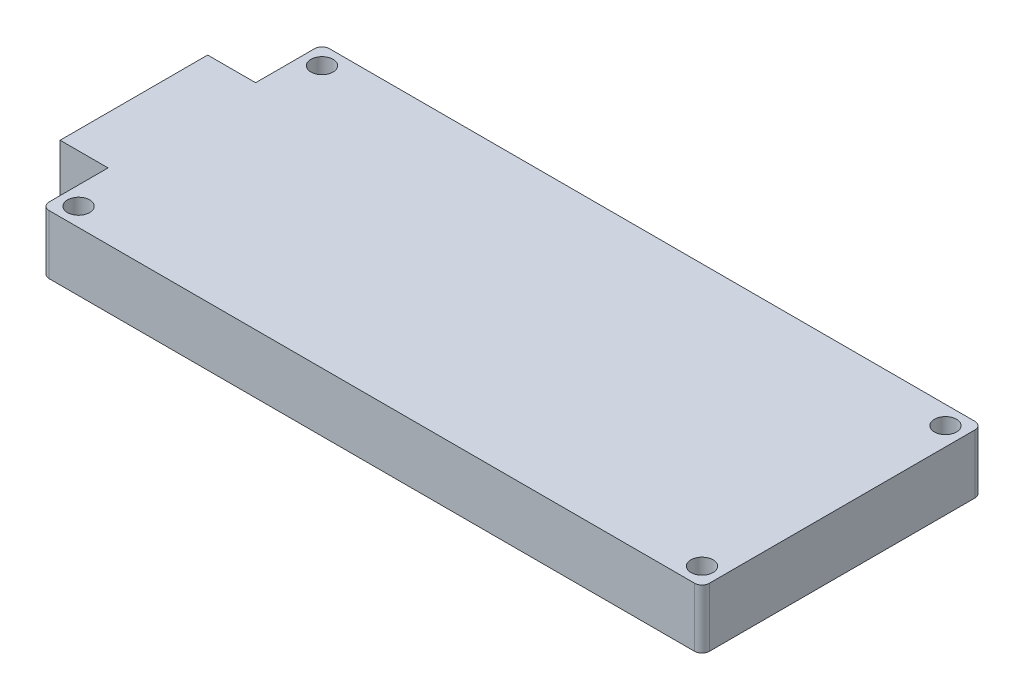
ISO-10303-21;
HEADER;
FILE_DESCRIPTION(('STEP AP214'),'2;1');
FILE_NAME('part.step','',(''),(''),'','','');
FILE_SCHEMA(('AUTOMOTIVE_DESIGN { 1 0 10303 214 1 1 1 1 }'));
ENDSEC;
DATA;
#1=APPLICATION_CONTEXT('core data for automotive mechanical design processes');
#2=APPLICATION_PROTOCOL_DEFINITION('international standard','automotive_design',2000,#1);
#3=PRODUCT_CONTEXT('',#1,'mechanical');
#4=PRODUCT('Part','Part','',(#3));
#5=PRODUCT_RELATED_PRODUCT_CATEGORY('part','',(#4));
#6=PRODUCT_DEFINITION_FORMATION('','',#4);
#7=PRODUCT_DEFINITION_CONTEXT('part definition',#1,'design');
#8=PRODUCT_DEFINITION('design','',#6,#7);
#9=PRODUCT_DEFINITION_SHAPE('','',#8);
#10=(LENGTH_UNIT() NAMED_UNIT(*) SI_UNIT(.MILLI.,.METRE.));
#11=(NAMED_UNIT(*) PLANE_ANGLE_UNIT() SI_UNIT($,.RADIAN.));
#12=(NAMED_UNIT(*) SI_UNIT($,.STERADIAN.) SOLID_ANGLE_UNIT());
#13=UNCERTAINTY_MEASURE_WITH_UNIT(LENGTH_MEASURE(1.E-05),#10,'distance_accuracy_value','');
#14=(GEOMETRIC_REPRESENTATION_CONTEXT(3) GLOBAL_UNCERTAINTY_ASSIGNED_CONTEXT((#13)) GLOBAL_UNIT_ASSIGNED_CONTEXT((#10,
#11,#12)) REPRESENTATION_CONTEXT('',''));
#15=CARTESIAN_POINT('',(0.,0.,0.));
#16=DIRECTION('',(0.,0.,1.));
#17=DIRECTION('',(1.,0.,0.));
#18=AXIS2_PLACEMENT_3D('',#15,#16,#17);
#19=CARTESIAN_POINT('',(-44.75,8.,-19.));
#20=DIRECTION('',(1.,0.,0.));
#21=DIRECTION('',(0.,0.,-1.));
#22=AXIS2_PLACEMENT_3D('',#19,#20,#21);
#23=PLANE('',#22);
#24=DIRECTION('',(0.,0.,1.));
#25=VECTOR('',#24,1.);
#26=CARTESIAN_POINT('',(-44.75,8.,-19.));
#27=LINE('',#26,#25);
#28=CARTESIAN_POINT('',(-44.75,8.,10.));
#29=VERTEX_POINT('',#28);
#30=CARTESIAN_POINT('',(-44.75,8.,18.));
#31=VERTEX_POINT('',#30);
#32=EDGE_CURVE('E47',#29,#31,#27,.T.);
#33=ORIENTED_EDGE('',*,*,#32,.F.);
#34=DIRECTION('',(0.,1.,0.));
#35=VECTOR('',#34,1.);
#36=CARTESIAN_POINT('',(-44.75,-21.0297408448131,10.));
#37=LINE('',#36,#35);
#38=CARTESIAN_POINT('',(-44.75,0.,10.));
#39=VERTEX_POINT('',#38);
#40=EDGE_CURVE('E153',#39,#29,#37,.T.);
#41=ORIENTED_EDGE('',*,*,#40,.F.);
#42=DIRECTION('',(0.,0.,1.));
#43=VECTOR('',#42,1.);
#44=CARTESIAN_POINT('',(-44.75,0.,-19.));
#45=LINE('',#44,#43);
#46=CARTESIAN_POINT('',(-44.75,0.,18.));
#47=VERTEX_POINT('',#46);
#48=EDGE_CURVE('E200',#39,#47,#45,.T.);
#49=ORIENTED_EDGE('',*,*,#48,.T.);
#50=DIRECTION('',(0.,-1.,0.));
#51=VECTOR('',#50,1.);
#52=CARTESIAN_POINT('',(-44.75,8.,18.));
#53=LINE('',#52,#51);
#54=EDGE_CURVE('E11',#47,#31,#53,.F.);
#55=ORIENTED_EDGE('',*,*,#54,.T.);
#56=EDGE_LOOP('',(#33,#41,#49,#55));
#57=FACE_BOUND('',#56,.T.);
#58=ADVANCED_FACE('F33',(#57),#23,.F.);
#59=CARTESIAN_POINT('',(44.75,8.,-19.));
#60=DIRECTION('',(-1.,0.,0.));
#61=DIRECTION('',(0.,0.,1.));
#62=AXIS2_PLACEMENT_3D('',#59,#60,#61);
#63=PLANE('',#62);
#64=DIRECTION('',(0.,0.,-1.));
#65=VECTOR('',#64,1.);
#66=CARTESIAN_POINT('',(44.75,0.,-19.));
#67=LINE('',#66,#65);
#68=CARTESIAN_POINT('',(44.75,0.,18.));
#69=VERTEX_POINT('',#68);
#70=CARTESIAN_POINT('',(44.75,0.,-18.));
#71=VERTEX_POINT('',#70);
#72=EDGE_CURVE('E181',#69,#71,#67,.T.);
#73=ORIENTED_EDGE('',*,*,#72,.T.);
#74=DIRECTION('',(0.,-1.,0.));
#75=VECTOR('',#74,1.);
#76=CARTESIAN_POINT('',(44.75,8.,-18.));
#77=LINE('',#76,#75);
#78=CARTESIAN_POINT('',(44.75,8.,-18.));
#79=VERTEX_POINT('',#78);
#80=EDGE_CURVE('E221',#71,#79,#77,.F.);
#81=ORIENTED_EDGE('',*,*,#80,.T.);
#82=DIRECTION('',(0.,0.,-1.));
#83=VECTOR('',#82,1.);
#84=CARTESIAN_POINT('',(44.75,8.,-19.));
#85=LINE('',#84,#83);
#86=CARTESIAN_POINT('',(44.75,8.,18.));
#87=VERTEX_POINT('',#86);
#88=EDGE_CURVE('E184',#87,#79,#85,.T.);
#89=ORIENTED_EDGE('',*,*,#88,.F.);
#90=DIRECTION('',(0.,-1.,0.));
#91=VECTOR('',#90,1.);
#92=CARTESIAN_POINT('',(44.75,8.,18.));
#93=LINE('',#92,#91);
#94=EDGE_CURVE('E218',#87,#69,#93,.T.);
#95=ORIENTED_EDGE('',*,*,#94,.T.);
#96=EDGE_LOOP('',(#73,#81,#89,#95));
#97=FACE_BOUND('',#96,.T.);
#98=ADVANCED_FACE('F264',(#97),#63,.F.);
#99=CARTESIAN_POINT('',(-44.75,8.,-19.));
#100=DIRECTION('',(0.,0.,1.));
#101=DIRECTION('',(1.,0.,0.));
#102=AXIS2_PLACEMENT_3D('',#99,#100,#101);
#103=PLANE('',#102);
#104=DIRECTION('',(-1.,0.,0.));
#105=VECTOR('',#104,1.);
#106=CARTESIAN_POINT('',(-44.75,8.,-19.));
#107=LINE('',#106,#105);
#108=CARTESIAN_POINT('',(43.75,8.,-19.));
#109=VERTEX_POINT('',#108);
#110=CARTESIAN_POINT('',(-43.75,8.,-19.));
#111=VERTEX_POINT('',#110);
#112=EDGE_CURVE('E186',#109,#111,#107,.T.);
#113=ORIENTED_EDGE('',*,*,#112,.F.);
#114=DIRECTION('',(0.,-1.,0.));
#115=VECTOR('',#114,1.);
#116=CARTESIAN_POINT('',(43.75,8.,-19.));
#117=LINE('',#116,#115);
#118=CARTESIAN_POINT('',(43.75,0.,-19.));
#119=VERTEX_POINT('',#118);
#120=EDGE_CURVE('E206',#109,#119,#117,.T.);
#121=ORIENTED_EDGE('',*,*,#120,.T.);
#122=DIRECTION('',(-1.,0.,0.));
#123=VECTOR('',#122,1.);
#124=CARTESIAN_POINT('',(-44.75,0.,-19.));
#125=LINE('',#124,#123);
#126=CARTESIAN_POINT('',(-43.75,0.,-19.));
#127=VERTEX_POINT('',#126);
#128=EDGE_CURVE('E197',#119,#127,#125,.T.);
#129=ORIENTED_EDGE('',*,*,#128,.T.);
#130=DIRECTION('',(0.,-1.,0.));
#131=VECTOR('',#130,1.);
#132=CARTESIAN_POINT('',(-43.75,8.,-19.));
#133=LINE('',#132,#131);
#134=EDGE_CURVE('E194',#127,#111,#133,.F.);
#135=ORIENTED_EDGE('',*,*,#134,.T.);
#136=EDGE_LOOP('',(#113,#121,#129,#135));
#137=FACE_BOUND('',#136,.T.);
#138=ADVANCED_FACE('F272',(#137),#103,.F.);
#139=CARTESIAN_POINT('',(-44.75,0.,-18.));
#140=VERTEX_POINT('',#139);
#141=CARTESIAN_POINT('',(-44.75,0.,-10.));
#142=VERTEX_POINT('',#141);
#143=EDGE_CURVE('E201',#140,#142,#45,.T.);
#144=ORIENTED_EDGE('',*,*,#143,.T.);
#145=DIRECTION('',(0.,1.,0.));
#146=VECTOR('',#145,1.);
#147=CARTESIAN_POINT('',(-44.75,-21.0297408448131,-10.));
#148=LINE('',#147,#146);
#149=CARTESIAN_POINT('',(-44.75,8.,-10.));
#150=VERTEX_POINT('',#149);
#151=EDGE_CURVE('E55',#142,#150,#148,.T.);
#152=ORIENTED_EDGE('',*,*,#151,.T.);
#153=CARTESIAN_POINT('',(-44.75,8.,-18.));
#154=VERTEX_POINT('',#153);
#155=EDGE_CURVE('E146',#154,#150,#27,.T.);
#156=ORIENTED_EDGE('',*,*,#155,.F.);
#157=DIRECTION('',(0.,-1.,0.));
#158=VECTOR('',#157,1.);
#159=CARTESIAN_POINT('',(-44.75,8.,-18.));
#160=LINE('',#159,#158);
#161=EDGE_CURVE('E41',#154,#140,#160,.T.);
#162=ORIENTED_EDGE('',*,*,#161,.T.);
#163=EDGE_LOOP('',(#144,#152,#156,#162));
#164=FACE_BOUND('',#163,.T.);
#165=ADVANCED_FACE('F238',(#164),#23,.F.);
#166=CARTESIAN_POINT('',(-44.75,8.,19.));
#167=DIRECTION('',(0.,0.,-1.));
#168=DIRECTION('',(-1.,0.,0.));
#169=AXIS2_PLACEMENT_3D('',#166,#167,#168);
#170=PLANE('',#169);
#171=DIRECTION('',(1.,0.,0.));
#172=VECTOR('',#171,1.);
#173=CARTESIAN_POINT('',(-44.75,0.,19.));
#174=LINE('',#173,#172);
#175=CARTESIAN_POINT('',(-43.75,0.,19.));
#176=VERTEX_POINT('',#175);
#177=CARTESIAN_POINT('',(43.75,0.,19.));
#178=VERTEX_POINT('',#177);
#179=EDGE_CURVE('E187',#176,#178,#174,.T.);
#180=ORIENTED_EDGE('',*,*,#179,.T.);
#181=DIRECTION('',(0.,-1.,0.));
#182=VECTOR('',#181,1.);
#183=CARTESIAN_POINT('',(43.75,8.,19.));
#184=LINE('',#183,#182);
#185=CARTESIAN_POINT('',(43.75,8.,19.));
#186=VERTEX_POINT('',#185);
#187=EDGE_CURVE('E234',#178,#186,#184,.F.);
#188=ORIENTED_EDGE('',*,*,#187,.T.);
#189=DIRECTION('',(1.,0.,0.));
#190=VECTOR('',#189,1.);
#191=CARTESIAN_POINT('',(-44.75,8.,19.));
#192=LINE('',#191,#190);
#193=CARTESIAN_POINT('',(-43.75,8.,19.));
#194=VERTEX_POINT('',#193);
#195=EDGE_CURVE('E191',#194,#186,#192,.T.);
#196=ORIENTED_EDGE('',*,*,#195,.F.);
#197=DIRECTION('',(0.,-1.,0.));
#198=VECTOR('',#197,1.);
#199=CARTESIAN_POINT('',(-43.75,8.,19.));
#200=LINE('',#199,#198);
#201=EDGE_CURVE('E231',#194,#176,#200,.T.);
#202=ORIENTED_EDGE('',*,*,#201,.T.);
#203=EDGE_LOOP('',(#180,#188,#196,#202));
#204=FACE_BOUND('',#203,.T.);
#205=ADVANCED_FACE('F255',(#204),#170,.F.);
#206=CARTESIAN_POINT('',(0.,8.,0.));
#207=DIRECTION('',(0.,1.,0.));
#208=DIRECTION('',(0.,0.,1.));
#209=AXIS2_PLACEMENT_3D('',#206,#207,#208);
#210=PLANE('',#209);
#211=CARTESIAN_POINT('',(-42.25,8.,16.5));
#212=DIRECTION('',(0.,1.,0.));
#213=DIRECTION('',(0.,0.,1.));
#214=AXIS2_PLACEMENT_3D('',#211,#212,#213);
#215=CIRCLE('',#214,1.5);
#216=CARTESIAN_POINT('',(-42.25,8.,18.));
#217=VERTEX_POINT('',#216);
#218=EDGE_CURVE('E159',#217,#217,#215,.T.);
#219=ORIENTED_EDGE('',*,*,#218,.F.);
#220=EDGE_LOOP('',(#219));
#221=FACE_BOUND('',#220,.T.);
#222=CARTESIAN_POINT('',(42.25,8.,16.5));
#223=DIRECTION('',(0.,1.,0.));
#224=DIRECTION('',(0.,0.,1.));
#225=AXIS2_PLACEMENT_3D('',#222,#223,#224);
#226=CIRCLE('',#225,1.5);
#227=CARTESIAN_POINT('',(42.25,8.,18.));
#228=VERTEX_POINT('',#227);
#229=EDGE_CURVE('E170',#228,#228,#226,.T.);
#230=ORIENTED_EDGE('',*,*,#229,.F.);
#231=EDGE_LOOP('',(#230));
#232=FACE_BOUND('',#231,.T.);
#233=CARTESIAN_POINT('',(42.25,8.,-16.5));
#234=DIRECTION('',(0.,1.,0.));
#235=DIRECTION('',(0.,0.,1.));
#236=AXIS2_PLACEMENT_3D('',#233,#234,#235);
#237=CIRCLE('',#236,1.5);
#238=CARTESIAN_POINT('',(42.25,8.,-15.));
#239=VERTEX_POINT('',#238);
#240=EDGE_CURVE('E164',#239,#239,#237,.T.);
#241=ORIENTED_EDGE('',*,*,#240,.F.);
#242=EDGE_LOOP('',(#241));
#243=FACE_BOUND('',#242,.T.);
#244=CARTESIAN_POINT('',(-42.25,8.,-16.5));
#245=DIRECTION('',(0.,1.,0.));
#246=DIRECTION('',(0.,0.,1.));
#247=AXIS2_PLACEMENT_3D('',#244,#245,#246);
#248=CIRCLE('',#247,1.5);
#249=CARTESIAN_POINT('',(-42.25,8.,-15.));
#250=VERTEX_POINT('',#249);
#251=EDGE_CURVE('E163',#250,#250,#248,.T.);
#252=ORIENTED_EDGE('',*,*,#251,.F.);
#253=EDGE_LOOP('',(#252));
#254=FACE_BOUND('',#253,.T.);
#255=ORIENTED_EDGE('',*,*,#88,.T.);
#256=CARTESIAN_POINT('',(43.75,8.,-18.));
#257=DIRECTION('',(0.,1.,0.));
#258=DIRECTION('',(0.,0.,1.));
#259=AXIS2_PLACEMENT_3D('',#256,#257,#258);
#260=CIRCLE('',#259,1.);
#261=EDGE_CURVE('E229',#79,#109,#260,.T.);
#262=ORIENTED_EDGE('',*,*,#261,.T.);
#263=ORIENTED_EDGE('',*,*,#112,.T.);
#264=CARTESIAN_POINT('',(-43.75,8.,-18.));
#265=DIRECTION('',(0.,1.,0.));
#266=DIRECTION('',(0.,0.,1.));
#267=AXIS2_PLACEMENT_3D('',#264,#265,#266);
#268=CIRCLE('',#267,1.);
#269=EDGE_CURVE('E223',#111,#154,#268,.T.);
#270=ORIENTED_EDGE('',*,*,#269,.T.);
#271=ORIENTED_EDGE('',*,*,#155,.T.);
#272=DIRECTION('',(-1.,0.,0.));
#273=VECTOR('',#272,1.);
#274=CARTESIAN_POINT('',(-44.75,8.,-10.));
#275=LINE('',#274,#273);
#276=CARTESIAN_POINT('',(-51.25,8.,-10.));
#277=VERTEX_POINT('',#276);
#278=EDGE_CURVE('E128',#150,#277,#275,.T.);
#279=ORIENTED_EDGE('',*,*,#278,.T.);
#280=DIRECTION('',(0.,0.,1.));
#281=VECTOR('',#280,1.);
#282=CARTESIAN_POINT('',(-51.25,8.,-10.));
#283=LINE('',#282,#281);
#284=CARTESIAN_POINT('',(-51.25,8.,10.));
#285=VERTEX_POINT('',#284);
#286=EDGE_CURVE('E136',#277,#285,#283,.T.);
#287=ORIENTED_EDGE('',*,*,#286,.T.);
#288=DIRECTION('',(1.,0.,0.));
#289=VECTOR('',#288,1.);
#290=CARTESIAN_POINT('',(-44.75,8.,10.));
#291=LINE('',#290,#289);
#292=EDGE_CURVE('E142',#285,#29,#291,.T.);
#293=ORIENTED_EDGE('',*,*,#292,.T.);
#294=ORIENTED_EDGE('',*,*,#32,.T.);
#295=CARTESIAN_POINT('',(-43.75,8.,18.));
#296=DIRECTION('',(0.,1.,0.));
#297=DIRECTION('',(0.,0.,1.));
#298=AXIS2_PLACEMENT_3D('',#295,#296,#297);
#299=CIRCLE('',#298,1.);
#300=EDGE_CURVE('E225',#31,#194,#299,.T.);
#301=ORIENTED_EDGE('',*,*,#300,.T.);
#302=ORIENTED_EDGE('',*,*,#195,.T.);
#303=CARTESIAN_POINT('',(43.75,8.,18.));
#304=DIRECTION('',(0.,1.,0.));
#305=DIRECTION('',(0.,0.,1.));
#306=AXIS2_PLACEMENT_3D('',#303,#304,#305);
#307=CIRCLE('',#306,1.);
#308=EDGE_CURVE('E227',#186,#87,#307,.T.);
#309=ORIENTED_EDGE('',*,*,#308,.T.);
#310=EDGE_LOOP('',(#255,#262,#263,#270,#271,#279,#287,#293,#294,#301,#302,#309));
#311=FACE_BOUND('',#310,.T.);
#312=ADVANCED_FACE('F145',(#221,#232,#243,#254,#311),#210,.T.);
#313=CARTESIAN_POINT('',(0.,0.,0.));
#314=DIRECTION('',(0.,1.,0.));
#315=DIRECTION('',(0.,0.,1.));
#316=AXIS2_PLACEMENT_3D('',#313,#314,#315);
#317=PLANE('',#316);
#318=CARTESIAN_POINT('',(-42.25,0.,16.5));
#319=DIRECTION('',(0.,1.,0.));
#320=DIRECTION('',(0.,0.,1.));
#321=AXIS2_PLACEMENT_3D('',#318,#319,#320);
#322=CIRCLE('',#321,1.5);
#323=CARTESIAN_POINT('',(-42.25,0.,18.));
#324=VERTEX_POINT('',#323);
#325=EDGE_CURVE('E173',#324,#324,#322,.T.);
#326=ORIENTED_EDGE('',*,*,#325,.T.);
#327=EDGE_LOOP('',(#326));
#328=FACE_BOUND('',#327,.T.);
#329=CARTESIAN_POINT('',(42.25,0.,16.5));
#330=DIRECTION('',(0.,1.,0.));
#331=DIRECTION('',(0.,0.,1.));
#332=AXIS2_PLACEMENT_3D('',#329,#330,#331);
#333=CIRCLE('',#332,1.5);
#334=CARTESIAN_POINT('',(42.25,0.,18.));
#335=VERTEX_POINT('',#334);
#336=EDGE_CURVE('E167',#335,#335,#333,.T.);
#337=ORIENTED_EDGE('',*,*,#336,.T.);
#338=EDGE_LOOP('',(#337));
#339=FACE_BOUND('',#338,.T.);
#340=CARTESIAN_POINT('',(42.25,0.,-16.5));
#341=DIRECTION('',(0.,1.,0.));
#342=DIRECTION('',(0.,0.,1.));
#343=AXIS2_PLACEMENT_3D('',#340,#341,#342);
#344=CIRCLE('',#343,1.5);
#345=CARTESIAN_POINT('',(42.25,0.,-15.));
#346=VERTEX_POINT('',#345);
#347=EDGE_CURVE('E160',#346,#346,#344,.T.);
#348=ORIENTED_EDGE('',*,*,#347,.T.);
#349=EDGE_LOOP('',(#348));
#350=FACE_BOUND('',#349,.T.);
#351=CARTESIAN_POINT('',(-42.25,0.,-16.5));
#352=DIRECTION('',(0.,1.,0.));
#353=DIRECTION('',(0.,0.,1.));
#354=AXIS2_PLACEMENT_3D('',#351,#352,#353);
#355=CIRCLE('',#354,1.5);
#356=CARTESIAN_POINT('',(-42.25,0.,-15.));
#357=VERTEX_POINT('',#356);
#358=EDGE_CURVE('E178',#357,#357,#355,.T.);
#359=ORIENTED_EDGE('',*,*,#358,.T.);
#360=EDGE_LOOP('',(#359));
#361=FACE_BOUND('',#360,.T.);
#362=ORIENTED_EDGE('',*,*,#128,.F.);
#363=CARTESIAN_POINT('',(43.75,0.,-18.));
#364=DIRECTION('',(0.,1.,0.));
#365=DIRECTION('',(0.,0.,1.));
#366=AXIS2_PLACEMENT_3D('',#363,#364,#365);
#367=CIRCLE('',#366,1.);
#368=EDGE_CURVE('E216',#119,#71,#367,.F.);
#369=ORIENTED_EDGE('',*,*,#368,.T.);
#370=ORIENTED_EDGE('',*,*,#72,.F.);
#371=CARTESIAN_POINT('',(43.75,0.,18.));
#372=DIRECTION('',(0.,1.,0.));
#373=DIRECTION('',(0.,0.,1.));
#374=AXIS2_PLACEMENT_3D('',#371,#372,#373);
#375=CIRCLE('',#374,1.);
#376=EDGE_CURVE('E214',#69,#178,#375,.F.);
#377=ORIENTED_EDGE('',*,*,#376,.T.);
#378=ORIENTED_EDGE('',*,*,#179,.F.);
#379=CARTESIAN_POINT('',(-43.75,0.,18.));
#380=DIRECTION('',(0.,1.,0.));
#381=DIRECTION('',(0.,0.,1.));
#382=AXIS2_PLACEMENT_3D('',#379,#380,#381);
#383=CIRCLE('',#382,1.);
#384=EDGE_CURVE('E211',#176,#47,#383,.F.);
#385=ORIENTED_EDGE('',*,*,#384,.T.);
#386=ORIENTED_EDGE('',*,*,#48,.F.);
#387=DIRECTION('',(-1.,0.,0.));
#388=VECTOR('',#387,1.);
#389=CARTESIAN_POINT('',(-44.75,0.,10.));
#390=LINE('',#389,#388);
#391=CARTESIAN_POINT('',(-51.25,0.,10.));
#392=VERTEX_POINT('',#391);
#393=EDGE_CURVE('E149',#39,#392,#390,.T.);
#394=ORIENTED_EDGE('',*,*,#393,.T.);
#395=DIRECTION('',(0.,0.,-1.));
#396=VECTOR('',#395,1.);
#397=CARTESIAN_POINT('',(-51.25,0.,-10.));
#398=LINE('',#397,#396);
#399=CARTESIAN_POINT('',(-51.25,0.,-10.));
#400=VERTEX_POINT('',#399);
#401=EDGE_CURVE('E155',#392,#400,#398,.T.);
#402=ORIENTED_EDGE('',*,*,#401,.T.);
#403=DIRECTION('',(1.,0.,0.));
#404=VECTOR('',#403,1.);
#405=CARTESIAN_POINT('',(-44.75,0.,-10.));
#406=LINE('',#405,#404);
#407=EDGE_CURVE('E130',#400,#142,#406,.T.);
#408=ORIENTED_EDGE('',*,*,#407,.T.);
#409=ORIENTED_EDGE('',*,*,#143,.F.);
#410=CARTESIAN_POINT('',(-43.75,0.,-18.));
#411=DIRECTION('',(0.,1.,0.));
#412=DIRECTION('',(0.,0.,1.));
#413=AXIS2_PLACEMENT_3D('',#410,#411,#412);
#414=CIRCLE('',#413,1.);
#415=EDGE_CURVE('E209',#140,#127,#414,.F.);
#416=ORIENTED_EDGE('',*,*,#415,.T.);
#417=EDGE_LOOP('',(#362,#369,#370,#377,#378,#385,#386,#394,#402,#408,#409,#416));
#418=FACE_BOUND('',#417,.T.);
#419=ADVANCED_FACE('F243',(#328,#339,#350,#361,#418),#317,.F.);
#420=CARTESIAN_POINT('',(-42.25,0.,-16.5));
#421=DIRECTION('',(0.,1.,0.));
#422=DIRECTION('',(0.,0.,1.));
#423=AXIS2_PLACEMENT_3D('',#420,#421,#422);
#424=CYLINDRICAL_SURFACE('',#423,1.5);
#425=ORIENTED_EDGE('',*,*,#358,.F.);
#426=EDGE_LOOP('',(#425));
#427=FACE_BOUND('',#426,.T.);
#428=ORIENTED_EDGE('',*,*,#251,.T.);
#429=EDGE_LOOP('',(#428));
#430=FACE_BOUND('',#429,.T.);
#431=ADVANCED_FACE('F342',(#427,#430),#424,.F.);
#432=CARTESIAN_POINT('',(42.25,0.,-16.5));
#433=DIRECTION('',(0.,1.,0.));
#434=DIRECTION('',(0.,0.,1.));
#435=AXIS2_PLACEMENT_3D('',#432,#433,#434);
#436=CYLINDRICAL_SURFACE('',#435,1.5);
#437=ORIENTED_EDGE('',*,*,#347,.F.);
#438=EDGE_LOOP('',(#437));
#439=FACE_BOUND('',#438,.T.);
#440=ORIENTED_EDGE('',*,*,#240,.T.);
#441=EDGE_LOOP('',(#440));
#442=FACE_BOUND('',#441,.T.);
#443=ADVANCED_FACE('F372',(#439,#442),#436,.F.);
#444=CARTESIAN_POINT('',(42.25,0.,16.5));
#445=DIRECTION('',(0.,1.,0.));
#446=DIRECTION('',(0.,0.,1.));
#447=AXIS2_PLACEMENT_3D('',#444,#445,#446);
#448=CYLINDRICAL_SURFACE('',#447,1.5);
#449=ORIENTED_EDGE('',*,*,#336,.F.);
#450=EDGE_LOOP('',(#449));
#451=FACE_BOUND('',#450,.T.);
#452=ORIENTED_EDGE('',*,*,#229,.T.);
#453=EDGE_LOOP('',(#452));
#454=FACE_BOUND('',#453,.T.);
#455=ADVANCED_FACE('F375',(#451,#454),#448,.F.);
#456=CARTESIAN_POINT('',(-42.25,0.,16.5));
#457=DIRECTION('',(0.,1.,0.));
#458=DIRECTION('',(0.,0.,1.));
#459=AXIS2_PLACEMENT_3D('',#456,#457,#458);
#460=CYLINDRICAL_SURFACE('',#459,1.5);
#461=ORIENTED_EDGE('',*,*,#325,.F.);
#462=EDGE_LOOP('',(#461));
#463=FACE_BOUND('',#462,.T.);
#464=ORIENTED_EDGE('',*,*,#218,.T.);
#465=EDGE_LOOP('',(#464));
#466=FACE_BOUND('',#465,.T.);
#467=ADVANCED_FACE('F298',(#463,#466),#460,.F.);
#468=CARTESIAN_POINT('',(43.75,8.,-18.));
#469=DIRECTION('',(0.,-1.,0.));
#470=DIRECTION('',(0.,0.,-1.));
#471=AXIS2_PLACEMENT_3D('',#468,#469,#470);
#472=CYLINDRICAL_SURFACE('',#471,1.);
#473=ORIENTED_EDGE('',*,*,#261,.F.);
#474=ORIENTED_EDGE('',*,*,#80,.F.);
#475=ORIENTED_EDGE('',*,*,#368,.F.);
#476=ORIENTED_EDGE('',*,*,#120,.F.);
#477=EDGE_LOOP('',(#473,#474,#475,#476));
#478=FACE_BOUND('',#477,.T.);
#479=ADVANCED_FACE('F270',(#478),#472,.T.);
#480=CARTESIAN_POINT('',(43.75,8.,18.));
#481=DIRECTION('',(0.,-1.,0.));
#482=DIRECTION('',(0.,0.,-1.));
#483=AXIS2_PLACEMENT_3D('',#480,#481,#482);
#484=CYLINDRICAL_SURFACE('',#483,1.);
#485=ORIENTED_EDGE('',*,*,#308,.F.);
#486=ORIENTED_EDGE('',*,*,#187,.F.);
#487=ORIENTED_EDGE('',*,*,#376,.F.);
#488=ORIENTED_EDGE('',*,*,#94,.F.);
#489=EDGE_LOOP('',(#485,#486,#487,#488));
#490=FACE_BOUND('',#489,.T.);
#491=ADVANCED_FACE('F261',(#490),#484,.T.);
#492=CARTESIAN_POINT('',(-43.75,8.,18.));
#493=DIRECTION('',(0.,-1.,0.));
#494=DIRECTION('',(0.,0.,-1.));
#495=AXIS2_PLACEMENT_3D('',#492,#493,#494);
#496=CYLINDRICAL_SURFACE('',#495,1.);
#497=ORIENTED_EDGE('',*,*,#300,.F.);
#498=ORIENTED_EDGE('',*,*,#54,.F.);
#499=ORIENTED_EDGE('',*,*,#384,.F.);
#500=ORIENTED_EDGE('',*,*,#201,.F.);
#501=EDGE_LOOP('',(#497,#498,#499,#500));
#502=FACE_BOUND('',#501,.T.);
#503=ADVANCED_FACE('F252',(#502),#496,.T.);
#504=CARTESIAN_POINT('',(-43.75,8.,-18.));
#505=DIRECTION('',(0.,-1.,0.));
#506=DIRECTION('',(0.,0.,-1.));
#507=AXIS2_PLACEMENT_3D('',#504,#505,#506);
#508=CYLINDRICAL_SURFACE('',#507,1.);
#509=ORIENTED_EDGE('',*,*,#269,.F.);
#510=ORIENTED_EDGE('',*,*,#134,.F.);
#511=ORIENTED_EDGE('',*,*,#415,.F.);
#512=ORIENTED_EDGE('',*,*,#161,.F.);
#513=EDGE_LOOP('',(#509,#510,#511,#512));
#514=FACE_BOUND('',#513,.T.);
#515=ADVANCED_FACE('F35',(#514),#508,.T.);
#516=CARTESIAN_POINT('',(-44.75,-21.0297408448131,10.));
#517=DIRECTION('',(0.,0.,1.));
#518=DIRECTION('',(1.,0.,0.));
#519=AXIS2_PLACEMENT_3D('',#516,#517,#518);
#520=PLANE('',#519);
#521=ORIENTED_EDGE('',*,*,#393,.F.);
#522=ORIENTED_EDGE('',*,*,#40,.T.);
#523=ORIENTED_EDGE('',*,*,#292,.F.);
#524=DIRECTION('',(0.,1.,0.));
#525=VECTOR('',#524,1.);
#526=CARTESIAN_POINT('',(-51.25,-21.0297408448131,10.));
#527=LINE('',#526,#525);
#528=EDGE_CURVE('E133',#392,#285,#527,.T.);
#529=ORIENTED_EDGE('',*,*,#528,.F.);
#530=EDGE_LOOP('',(#521,#522,#523,#529));
#531=FACE_BOUND('',#530,.T.);
#532=ADVANCED_FACE('F246',(#531),#520,.T.);
#533=CARTESIAN_POINT('',(-51.25,-21.0297408448131,-10.));
#534=DIRECTION('',(-1.,0.,0.));
#535=DIRECTION('',(0.,0.,1.));
#536=AXIS2_PLACEMENT_3D('',#533,#534,#535);
#537=PLANE('',#536);
#538=ORIENTED_EDGE('',*,*,#401,.F.);
#539=ORIENTED_EDGE('',*,*,#528,.T.);
#540=ORIENTED_EDGE('',*,*,#286,.F.);
#541=DIRECTION('',(0.,1.,0.));
#542=VECTOR('',#541,1.);
#543=CARTESIAN_POINT('',(-51.25,-21.0297408448131,-10.));
#544=LINE('',#543,#542);
#545=EDGE_CURVE('E124',#400,#277,#544,.T.);
#546=ORIENTED_EDGE('',*,*,#545,.F.);
#547=EDGE_LOOP('',(#538,#539,#540,#546));
#548=FACE_BOUND('',#547,.T.);
#549=ADVANCED_FACE('F137',(#548),#537,.T.);
#550=CARTESIAN_POINT('',(-44.75,-21.0297408448131,-10.));
#551=DIRECTION('',(0.,0.,-1.));
#552=DIRECTION('',(-1.,0.,0.));
#553=AXIS2_PLACEMENT_3D('',#550,#551,#552);
#554=PLANE('',#553);
#555=ORIENTED_EDGE('',*,*,#407,.F.);
#556=ORIENTED_EDGE('',*,*,#545,.T.);
#557=ORIENTED_EDGE('',*,*,#278,.F.);
#558=ORIENTED_EDGE('',*,*,#151,.F.);
#559=EDGE_LOOP('',(#555,#556,#557,#558));
#560=FACE_BOUND('',#559,.T.);
#561=ADVANCED_FACE('F126',(#560),#554,.T.);
#562=CLOSED_SHELL('',(#58,#98,#138,#165,#205,#312,#419,#431,#443,#455,#467,#479,#491,#503,#515,
#532,#549,#561));
#563=MANIFOLD_SOLID_BREP('B2',#562);
#564=ADVANCED_BREP_SHAPE_REPRESENTATION('',(#18,#563),#14);
#565=SHAPE_DEFINITION_REPRESENTATION(#9,#564);
ENDSEC;
END-ISO-10303-21;
